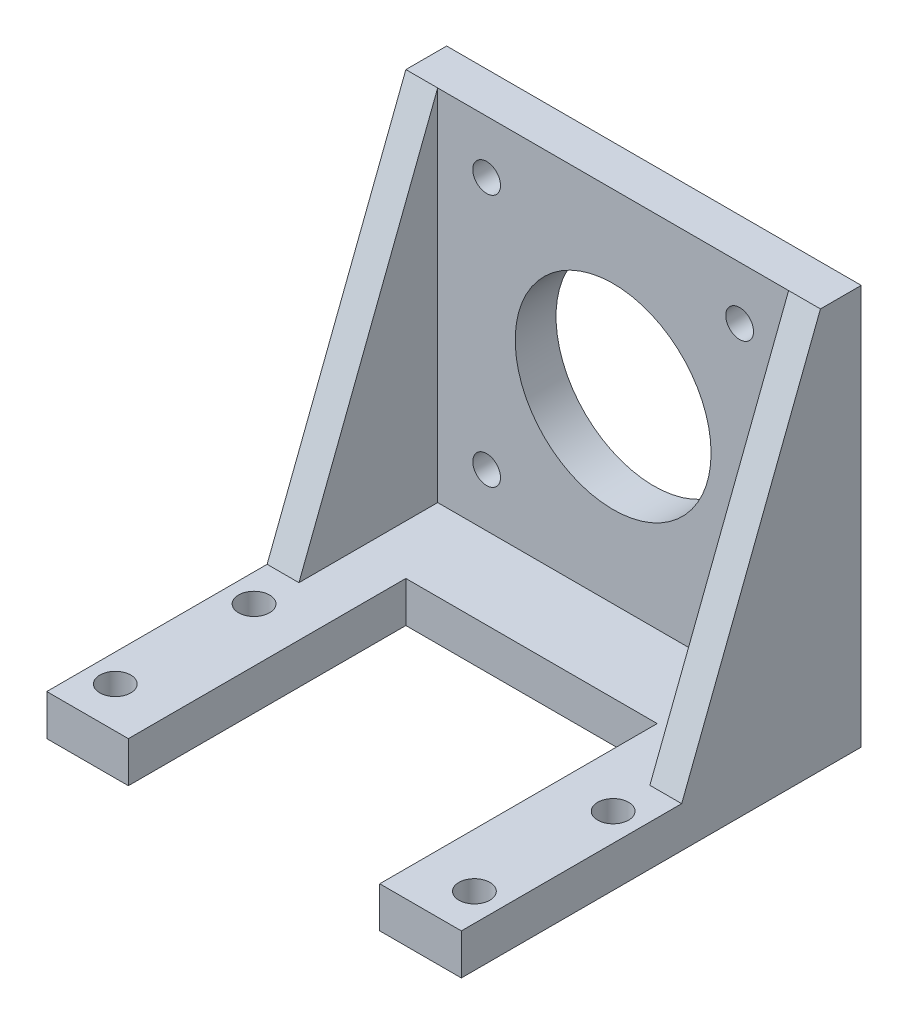
ISO-10303-21;
HEADER;
FILE_DESCRIPTION(('STEP AP214'),'2;1');
FILE_NAME('part.step','',(''),(''),'','','');
FILE_SCHEMA(('AUTOMOTIVE_DESIGN { 1 0 10303 214 1 1 1 1 }'));
ENDSEC;
DATA;
#1=APPLICATION_CONTEXT('core data for automotive mechanical design processes');
#2=APPLICATION_PROTOCOL_DEFINITION('international standard','automotive_design',2000,#1);
#3=PRODUCT_CONTEXT('',#1,'mechanical');
#4=PRODUCT('Part','Part','',(#3));
#5=PRODUCT_RELATED_PRODUCT_CATEGORY('part','',(#4));
#6=PRODUCT_DEFINITION_FORMATION('','',#4);
#7=PRODUCT_DEFINITION_CONTEXT('part definition',#1,'design');
#8=PRODUCT_DEFINITION('design','',#6,#7);
#9=PRODUCT_DEFINITION_SHAPE('','',#8);
#10=(LENGTH_UNIT() NAMED_UNIT(*) SI_UNIT(.MILLI.,.METRE.));
#11=(NAMED_UNIT(*) PLANE_ANGLE_UNIT() SI_UNIT($,.RADIAN.));
#12=(NAMED_UNIT(*) SI_UNIT($,.STERADIAN.) SOLID_ANGLE_UNIT());
#13=UNCERTAINTY_MEASURE_WITH_UNIT(LENGTH_MEASURE(1.E-05),#10,'distance_accuracy_value','');
#14=(GEOMETRIC_REPRESENTATION_CONTEXT(3) GLOBAL_UNCERTAINTY_ASSIGNED_CONTEXT((#13)) GLOBAL_UNIT_ASSIGNED_CONTEXT((#10,
#11,#12)) REPRESENTATION_CONTEXT('',''));
#15=CARTESIAN_POINT('',(0.,0.,0.));
#16=DIRECTION('',(0.,0.,1.));
#17=DIRECTION('',(1.,0.,0.));
#18=AXIS2_PLACEMENT_3D('',#15,#16,#17);
#19=CARTESIAN_POINT('',(25.4,22.,-22.));
#20=DIRECTION('',(0.,0.,-1.));
#21=DIRECTION('',(0.,1.,0.));
#22=AXIS2_PLACEMENT_3D('',#19,#20,#21);
#23=PLANE('',#22);
#24=CARTESIAN_POINT('',(-15.5,15.5,-22.));
#25=DIRECTION('',(0.,0.,1.));
#26=DIRECTION('',(1.,0.,0.));
#27=AXIS2_PLACEMENT_3D('',#24,#25,#26);
#28=CIRCLE('',#27,1.7);
#29=CARTESIAN_POINT('',(-13.8,15.5,-22.));
#30=VERTEX_POINT('',#29);
#31=EDGE_CURVE('E232',#30,#30,#28,.T.);
#32=ORIENTED_EDGE('',*,*,#31,.F.);
#33=EDGE_LOOP('',(#32));
#34=FACE_BOUND('',#33,.T.);
#35=CARTESIAN_POINT('',(15.5,15.5,-22.));
#36=DIRECTION('',(0.,0.,1.));
#37=DIRECTION('',(1.,0.,0.));
#38=AXIS2_PLACEMENT_3D('',#35,#36,#37);
#39=CIRCLE('',#38,1.7);
#40=CARTESIAN_POINT('',(17.2,15.5,-22.));
#41=VERTEX_POINT('',#40);
#42=EDGE_CURVE('E233',#41,#41,#39,.T.);
#43=ORIENTED_EDGE('',*,*,#42,.F.);
#44=EDGE_LOOP('',(#43));
#45=FACE_BOUND('',#44,.T.);
#46=CARTESIAN_POINT('',(15.5,-15.5,-22.));
#47=DIRECTION('',(0.,0.,1.));
#48=DIRECTION('',(1.,0.,0.));
#49=AXIS2_PLACEMENT_3D('',#46,#47,#48);
#50=CIRCLE('',#49,1.7);
#51=CARTESIAN_POINT('',(17.2,-15.5,-22.));
#52=VERTEX_POINT('',#51);
#53=EDGE_CURVE('E239',#52,#52,#50,.T.);
#54=ORIENTED_EDGE('',*,*,#53,.F.);
#55=EDGE_LOOP('',(#54));
#56=FACE_BOUND('',#55,.T.);
#57=CARTESIAN_POINT('',(-15.5,-15.5,-22.));
#58=DIRECTION('',(0.,0.,1.));
#59=DIRECTION('',(1.,0.,0.));
#60=AXIS2_PLACEMENT_3D('',#57,#58,#59);
#61=CIRCLE('',#60,1.7);
#62=CARTESIAN_POINT('',(-13.8,-15.5,-22.));
#63=VERTEX_POINT('',#62);
#64=EDGE_CURVE('E245',#63,#63,#61,.T.);
#65=ORIENTED_EDGE('',*,*,#64,.F.);
#66=EDGE_LOOP('',(#65));
#67=FACE_BOUND('',#66,.T.);
#68=CARTESIAN_POINT('',(0.,0.,-22.));
#69=DIRECTION('',(0.,0.,1.));
#70=DIRECTION('',(1.,0.,0.));
#71=AXIS2_PLACEMENT_3D('',#68,#69,#70);
#72=CIRCLE('',#71,12.);
#73=CARTESIAN_POINT('',(12.,0.,-22.));
#74=VERTEX_POINT('',#73);
#75=EDGE_CURVE('E222',#74,#74,#72,.T.);
#76=ORIENTED_EDGE('',*,*,#75,.F.);
#77=EDGE_LOOP('',(#76));
#78=FACE_BOUND('',#77,.T.);
#79=DIRECTION('',(-1.,0.,0.));
#80=VECTOR('',#79,1.);
#81=CARTESIAN_POINT('',(25.4,22.,-22.));
#82=LINE('',#81,#80);
#83=CARTESIAN_POINT('',(21.5,22.,-22.));
#84=VERTEX_POINT('',#83);
#85=CARTESIAN_POINT('',(-21.5,22.,-22.));
#86=VERTEX_POINT('',#85);
#87=EDGE_CURVE('E289',#84,#86,#82,.T.);
#88=ORIENTED_EDGE('',*,*,#87,.T.);
#89=DIRECTION('',(0.,-1.,0.));
#90=VECTOR('',#89,1.);
#91=CARTESIAN_POINT('',(-21.5,0.,-22.));
#92=LINE('',#91,#90);
#93=CARTESIAN_POINT('',(-21.5,-22.,-22.));
#94=VERTEX_POINT('',#93);
#95=EDGE_CURVE('E62',#86,#94,#92,.T.);
#96=ORIENTED_EDGE('',*,*,#95,.T.);
#97=DIRECTION('',(-1.,0.,0.));
#98=VECTOR('',#97,1.);
#99=CARTESIAN_POINT('',(25.4,-22.,-22.));
#100=LINE('',#99,#98);
#101=CARTESIAN_POINT('',(21.5,-22.,-22.));
#102=VERTEX_POINT('',#101);
#103=EDGE_CURVE('E288',#102,#94,#100,.T.);
#104=ORIENTED_EDGE('',*,*,#103,.F.);
#105=DIRECTION('',(0.,1.,0.));
#106=VECTOR('',#105,1.);
#107=CARTESIAN_POINT('',(21.5,0.,-22.));
#108=LINE('',#107,#106);
#109=EDGE_CURVE('E166',#102,#84,#108,.T.);
#110=ORIENTED_EDGE('',*,*,#109,.T.);
#111=EDGE_LOOP('',(#88,#96,#104,#110));
#112=FACE_BOUND('',#111,.T.);
#113=ADVANCED_FACE('F39',(#34,#45,#56,#67,#78,#112),#23,.F.);
#114=CARTESIAN_POINT('',(25.4,-22.,22.));
#115=DIRECTION('',(0.,-1.,0.));
#116=DIRECTION('',(0.,0.,-1.));
#117=AXIS2_PLACEMENT_3D('',#114,#115,#116);
#118=PLANE('',#117);
#119=CARTESIAN_POINT('',(22.,-22.,0.));
#120=DIRECTION('',(0.,1.,0.));
#121=DIRECTION('',(0.,0.,1.));
#122=AXIS2_PLACEMENT_3D('',#119,#120,#121);
#123=CIRCLE('',#122,1.89865);
#124=CARTESIAN_POINT('',(22.,-22.,1.89865));
#125=VERTEX_POINT('',#124);
#126=EDGE_CURVE('E188',#125,#125,#123,.T.);
#127=ORIENTED_EDGE('',*,*,#126,.F.);
#128=EDGE_LOOP('',(#127));
#129=FACE_BOUND('',#128,.T.);
#130=CARTESIAN_POINT('',(-22.,-22.,17.));
#131=DIRECTION('',(0.,1.,0.));
#132=DIRECTION('',(0.,0.,1.));
#133=AXIS2_PLACEMENT_3D('',#130,#131,#132);
#134=CIRCLE('',#133,1.89865);
#135=CARTESIAN_POINT('',(-22.,-22.,18.89865));
#136=VERTEX_POINT('',#135);
#137=EDGE_CURVE('E173',#136,#136,#134,.T.);
#138=ORIENTED_EDGE('',*,*,#137,.F.);
#139=EDGE_LOOP('',(#138));
#140=FACE_BOUND('',#139,.T.);
#141=CARTESIAN_POINT('',(22.,-22.,17.));
#142=DIRECTION('',(0.,1.,0.));
#143=DIRECTION('',(0.,0.,1.));
#144=AXIS2_PLACEMENT_3D('',#141,#142,#143);
#145=CIRCLE('',#144,1.89865);
#146=CARTESIAN_POINT('',(22.,-22.,18.89865));
#147=VERTEX_POINT('',#146);
#148=EDGE_CURVE('E182',#147,#147,#145,.T.);
#149=ORIENTED_EDGE('',*,*,#148,.F.);
#150=EDGE_LOOP('',(#149));
#151=FACE_BOUND('',#150,.T.);
#152=CARTESIAN_POINT('',(-22.,-22.,0.));
#153=DIRECTION('',(0.,1.,0.));
#154=DIRECTION('',(0.,0.,1.));
#155=AXIS2_PLACEMENT_3D('',#152,#153,#154);
#156=CIRCLE('',#155,1.89865);
#157=CARTESIAN_POINT('',(-22.,-22.,1.89865000000001));
#158=VERTEX_POINT('',#157);
#159=EDGE_CURVE('E189',#158,#158,#156,.T.);
#160=ORIENTED_EDGE('',*,*,#159,.F.);
#161=EDGE_LOOP('',(#160));
#162=FACE_BOUND('',#161,.T.);
#163=ORIENTED_EDGE('',*,*,#103,.T.);
#164=DIRECTION('',(0.,0.,1.));
#165=VECTOR('',#164,1.);
#166=CARTESIAN_POINT('',(-21.5,-22.,0.));
#167=LINE('',#166,#165);
#168=CARTESIAN_POINT('',(-21.5,-22.,-4.99999999999999));
#169=VERTEX_POINT('',#168);
#170=EDGE_CURVE('E54',#94,#169,#167,.T.);
#171=ORIENTED_EDGE('',*,*,#170,.T.);
#172=DIRECTION('',(-1.,0.,0.));
#173=VECTOR('',#172,1.);
#174=CARTESIAN_POINT('',(47.169905660283,-22.,-5.));
#175=LINE('',#174,#173);
#176=CARTESIAN_POINT('',(-25.4,-22.,-5.));
#177=VERTEX_POINT('',#176);
#178=EDGE_CURVE('E150',#169,#177,#175,.T.);
#179=ORIENTED_EDGE('',*,*,#178,.T.);
#180=DIRECTION('',(0.,0.,1.));
#181=VECTOR('',#180,1.);
#182=CARTESIAN_POINT('',(-25.4,-22.,22.));
#183=LINE('',#182,#181);
#184=CARTESIAN_POINT('',(-25.4,-22.,22.));
#185=VERTEX_POINT('',#184);
#186=EDGE_CURVE('E137',#177,#185,#183,.T.);
#187=ORIENTED_EDGE('',*,*,#186,.T.);
#188=DIRECTION('',(-1.,0.,0.));
#189=VECTOR('',#188,1.);
#190=CARTESIAN_POINT('',(25.4,-22.,22.));
#191=LINE('',#190,#189);
#192=CARTESIAN_POINT('',(-15.4,-22.,22.));
#193=VERTEX_POINT('',#192);
#194=EDGE_CURVE('E284',#193,#185,#191,.T.);
#195=ORIENTED_EDGE('',*,*,#194,.F.);
#196=DIRECTION('',(0.,0.,1.));
#197=VECTOR('',#196,1.);
#198=CARTESIAN_POINT('',(-15.4,-22.,22.));
#199=LINE('',#198,#197);
#200=CARTESIAN_POINT('',(-15.4,-22.,-12.));
#201=VERTEX_POINT('',#200);
#202=EDGE_CURVE('E207',#201,#193,#199,.T.);
#203=ORIENTED_EDGE('',*,*,#202,.F.);
#204=DIRECTION('',(-1.,0.,0.));
#205=VECTOR('',#204,1.);
#206=CARTESIAN_POINT('',(-15.4,-22.,-12.));
#207=LINE('',#206,#205);
#208=CARTESIAN_POINT('',(15.4,-22.,-12.));
#209=VERTEX_POINT('',#208);
#210=EDGE_CURVE('E216',#209,#201,#207,.T.);
#211=ORIENTED_EDGE('',*,*,#210,.F.);
#212=DIRECTION('',(0.,0.,-1.));
#213=VECTOR('',#212,1.);
#214=CARTESIAN_POINT('',(15.4,-22.,22.));
#215=LINE('',#214,#213);
#216=CARTESIAN_POINT('',(15.4,-22.,22.));
#217=VERTEX_POINT('',#216);
#218=EDGE_CURVE('E200',#217,#209,#215,.T.);
#219=ORIENTED_EDGE('',*,*,#218,.F.);
#220=CARTESIAN_POINT('',(25.4,-22.,22.));
#221=VERTEX_POINT('',#220);
#222=EDGE_CURVE('E285',#221,#217,#191,.T.);
#223=ORIENTED_EDGE('',*,*,#222,.F.);
#224=DIRECTION('',(0.,0.,1.));
#225=VECTOR('',#224,1.);
#226=CARTESIAN_POINT('',(25.4,-22.,22.));
#227=LINE('',#226,#225);
#228=CARTESIAN_POINT('',(25.4,-22.,-5.));
#229=VERTEX_POINT('',#228);
#230=EDGE_CURVE('E266',#229,#221,#227,.T.);
#231=ORIENTED_EDGE('',*,*,#230,.F.);
#232=DIRECTION('',(1.,0.,0.));
#233=VECTOR('',#232,1.);
#234=CARTESIAN_POINT('',(-47.169905660283,-22.,-5.));
#235=LINE('',#234,#233);
#236=CARTESIAN_POINT('',(21.5,-22.,-5.));
#237=VERTEX_POINT('',#236);
#238=EDGE_CURVE('E175',#237,#229,#235,.T.);
#239=ORIENTED_EDGE('',*,*,#238,.F.);
#240=DIRECTION('',(0.,0.,-1.));
#241=VECTOR('',#240,1.);
#242=CARTESIAN_POINT('',(21.5,-22.,0.));
#243=LINE('',#242,#241);
#244=EDGE_CURVE('E170',#237,#102,#243,.T.);
#245=ORIENTED_EDGE('',*,*,#244,.T.);
#246=EDGE_LOOP('',(#163,#171,#179,#187,#195,#203,#211,#219,#223,#231,#239,#245));
#247=FACE_BOUND('',#246,.T.);
#248=ADVANCED_FACE('F151',(#129,#140,#151,#162,#247),#118,.F.);
#249=CARTESIAN_POINT('',(25.4,-22.,22.));
#250=DIRECTION('',(0.,0.,-1.));
#251=DIRECTION('',(-1.,0.,0.));
#252=AXIS2_PLACEMENT_3D('',#249,#250,#251);
#253=PLANE('',#252);
#254=ORIENTED_EDGE('',*,*,#222,.T.);
#255=DIRECTION('',(0.,1.,0.));
#256=VECTOR('',#255,1.);
#257=CARTESIAN_POINT('',(15.4,-27.,22.));
#258=LINE('',#257,#256);
#259=CARTESIAN_POINT('',(15.4,-27.,22.));
#260=VERTEX_POINT('',#259);
#261=EDGE_CURVE('E220',#260,#217,#258,.T.);
#262=ORIENTED_EDGE('',*,*,#261,.F.);
#263=DIRECTION('',(-1.,0.,0.));
#264=VECTOR('',#263,1.);
#265=CARTESIAN_POINT('',(25.4,-27.,22.));
#266=LINE('',#265,#264);
#267=CARTESIAN_POINT('',(25.4,-27.,22.));
#268=VERTEX_POINT('',#267);
#269=EDGE_CURVE('E281',#268,#260,#266,.T.);
#270=ORIENTED_EDGE('',*,*,#269,.F.);
#271=DIRECTION('',(0.,-1.,0.));
#272=VECTOR('',#271,1.);
#273=CARTESIAN_POINT('',(25.4,-22.,22.));
#274=LINE('',#273,#272);
#275=EDGE_CURVE('E268',#221,#268,#274,.T.);
#276=ORIENTED_EDGE('',*,*,#275,.F.);
#277=EDGE_LOOP('',(#254,#262,#270,#276));
#278=FACE_BOUND('',#277,.T.);
#279=ADVANCED_FACE('F315',(#278),#253,.F.);
#280=CARTESIAN_POINT('',(25.4,22.,-27.));
#281=DIRECTION('',(0.,0.,1.));
#282=DIRECTION('',(0.,-1.,0.));
#283=AXIS2_PLACEMENT_3D('',#280,#281,#282);
#284=PLANE('',#283);
#285=CARTESIAN_POINT('',(0.,0.,-27.));
#286=DIRECTION('',(0.,0.,1.));
#287=DIRECTION('',(1.,0.,0.));
#288=AXIS2_PLACEMENT_3D('',#285,#286,#287);
#289=CIRCLE('',#288,12.);
#290=CARTESIAN_POINT('',(12.,0.,-27.));
#291=VERTEX_POINT('',#290);
#292=EDGE_CURVE('E248',#291,#291,#289,.T.);
#293=ORIENTED_EDGE('',*,*,#292,.T.);
#294=EDGE_LOOP('',(#293));
#295=FACE_BOUND('',#294,.T.);
#296=CARTESIAN_POINT('',(-15.5,-15.5,-27.));
#297=DIRECTION('',(0.,0.,1.));
#298=DIRECTION('',(1.,0.,0.));
#299=AXIS2_PLACEMENT_3D('',#296,#297,#298);
#300=CIRCLE('',#299,1.7);
#301=CARTESIAN_POINT('',(-13.8,-15.5,-27.));
#302=VERTEX_POINT('',#301);
#303=EDGE_CURVE('E242',#302,#302,#300,.T.);
#304=ORIENTED_EDGE('',*,*,#303,.T.);
#305=EDGE_LOOP('',(#304));
#306=FACE_BOUND('',#305,.T.);
#307=CARTESIAN_POINT('',(15.5,-15.5,-27.));
#308=DIRECTION('',(0.,0.,1.));
#309=DIRECTION('',(1.,0.,0.));
#310=AXIS2_PLACEMENT_3D('',#307,#308,#309);
#311=CIRCLE('',#310,1.7);
#312=CARTESIAN_POINT('',(17.2,-15.5,-27.));
#313=VERTEX_POINT('',#312);
#314=EDGE_CURVE('E236',#313,#313,#311,.T.);
#315=ORIENTED_EDGE('',*,*,#314,.T.);
#316=EDGE_LOOP('',(#315));
#317=FACE_BOUND('',#316,.T.);
#318=CARTESIAN_POINT('',(15.5,15.5,-27.));
#319=DIRECTION('',(0.,0.,1.));
#320=DIRECTION('',(1.,0.,0.));
#321=AXIS2_PLACEMENT_3D('',#318,#319,#320);
#322=CIRCLE('',#321,1.7);
#323=CARTESIAN_POINT('',(17.2,15.5,-27.));
#324=VERTEX_POINT('',#323);
#325=EDGE_CURVE('E229',#324,#324,#322,.T.);
#326=ORIENTED_EDGE('',*,*,#325,.T.);
#327=EDGE_LOOP('',(#326));
#328=FACE_BOUND('',#327,.T.);
#329=CARTESIAN_POINT('',(-15.5,15.5,-27.));
#330=DIRECTION('',(0.,0.,1.));
#331=DIRECTION('',(1.,0.,0.));
#332=AXIS2_PLACEMENT_3D('',#329,#330,#331);
#333=CIRCLE('',#332,1.7);
#334=CARTESIAN_POINT('',(-13.8,15.5,-27.));
#335=VERTEX_POINT('',#334);
#336=EDGE_CURVE('E253',#335,#335,#333,.T.);
#337=ORIENTED_EDGE('',*,*,#336,.T.);
#338=EDGE_LOOP('',(#337));
#339=FACE_BOUND('',#338,.T.);
#340=DIRECTION('',(0.,1.,0.));
#341=VECTOR('',#340,1.);
#342=CARTESIAN_POINT('',(-25.4,22.,-27.));
#343=LINE('',#342,#341);
#344=CARTESIAN_POINT('',(-25.4,-27.,-27.));
#345=VERTEX_POINT('',#344);
#346=CARTESIAN_POINT('',(-25.4,22.,-27.));
#347=VERTEX_POINT('',#346);
#348=EDGE_CURVE('E256',#345,#347,#343,.T.);
#349=ORIENTED_EDGE('',*,*,#348,.T.);
#350=DIRECTION('',(-1.,0.,0.));
#351=VECTOR('',#350,1.);
#352=CARTESIAN_POINT('',(25.4,22.,-27.));
#353=LINE('',#352,#351);
#354=CARTESIAN_POINT('',(25.4,22.,-27.));
#355=VERTEX_POINT('',#354);
#356=EDGE_CURVE('E12',#355,#347,#353,.T.);
#357=ORIENTED_EDGE('',*,*,#356,.F.);
#358=DIRECTION('',(0.,1.,0.));
#359=VECTOR('',#358,1.);
#360=CARTESIAN_POINT('',(25.4,22.,-27.));
#361=LINE('',#360,#359);
#362=CARTESIAN_POINT('',(25.4,-27.,-27.));
#363=VERTEX_POINT('',#362);
#364=EDGE_CURVE('E259',#363,#355,#361,.T.);
#365=ORIENTED_EDGE('',*,*,#364,.F.);
#366=DIRECTION('',(-1.,0.,0.));
#367=VECTOR('',#366,1.);
#368=CARTESIAN_POINT('',(25.4,-27.,-27.));
#369=LINE('',#368,#367);
#370=EDGE_CURVE('E272',#363,#345,#369,.T.);
#371=ORIENTED_EDGE('',*,*,#370,.T.);
#372=EDGE_LOOP('',(#349,#357,#365,#371));
#373=FACE_BOUND('',#372,.T.);
#374=ADVANCED_FACE('F41',(#295,#306,#317,#328,#339,#373),#284,.F.);
#375=CARTESIAN_POINT('',(25.4,22.,-22.));
#376=DIRECTION('',(0.,-1.,0.));
#377=DIRECTION('',(0.,0.,-1.));
#378=AXIS2_PLACEMENT_3D('',#375,#376,#377);
#379=PLANE('',#378);
#380=DIRECTION('',(0.,0.,1.));
#381=VECTOR('',#380,1.);
#382=CARTESIAN_POINT('',(-25.4,22.,-22.));
#383=LINE('',#382,#381);
#384=CARTESIAN_POINT('',(-25.4,22.,-22.));
#385=VERTEX_POINT('',#384);
#386=EDGE_CURVE('E147',#347,#385,#383,.T.);
#387=ORIENTED_EDGE('',*,*,#386,.T.);
#388=DIRECTION('',(-1.,0.,0.));
#389=VECTOR('',#388,1.);
#390=CARTESIAN_POINT('',(47.169905660283,22.,-22.));
#391=LINE('',#390,#389);
#392=EDGE_CURVE('E158',#86,#385,#391,.T.);
#393=ORIENTED_EDGE('',*,*,#392,.F.);
#394=ORIENTED_EDGE('',*,*,#87,.F.);
#395=CARTESIAN_POINT('',(25.4,22.,-22.));
#396=VERTEX_POINT('',#395);
#397=EDGE_CURVE('E47',#396,#84,#82,.T.);
#398=ORIENTED_EDGE('',*,*,#397,.F.);
#399=DIRECTION('',(0.,0.,1.));
#400=VECTOR('',#399,1.);
#401=CARTESIAN_POINT('',(25.4,22.,-22.));
#402=LINE('',#401,#400);
#403=EDGE_CURVE('E262',#355,#396,#402,.T.);
#404=ORIENTED_EDGE('',*,*,#403,.F.);
#405=ORIENTED_EDGE('',*,*,#356,.T.);
#406=EDGE_LOOP('',(#387,#393,#394,#398,#404,#405));
#407=FACE_BOUND('',#406,.T.);
#408=ADVANCED_FACE('F321',(#407),#379,.F.);
#409=CARTESIAN_POINT('',(-15.4,-27.,22.));
#410=VERTEX_POINT('',#409);
#411=CARTESIAN_POINT('',(-25.4,-27.,22.));
#412=VERTEX_POINT('',#411);
#413=EDGE_CURVE('E280',#410,#412,#266,.T.);
#414=ORIENTED_EDGE('',*,*,#413,.F.);
#415=DIRECTION('',(0.,1.,0.));
#416=VECTOR('',#415,1.);
#417=CARTESIAN_POINT('',(-15.4,-27.,22.));
#418=LINE('',#417,#416);
#419=EDGE_CURVE('E223',#410,#193,#418,.T.);
#420=ORIENTED_EDGE('',*,*,#419,.T.);
#421=ORIENTED_EDGE('',*,*,#194,.T.);
#422=DIRECTION('',(0.,-1.,0.));
#423=VECTOR('',#422,1.);
#424=CARTESIAN_POINT('',(-25.4,-22.,22.));
#425=LINE('',#424,#423);
#426=EDGE_CURVE('E144',#185,#412,#425,.T.);
#427=ORIENTED_EDGE('',*,*,#426,.T.);
#428=EDGE_LOOP('',(#414,#420,#421,#427));
#429=FACE_BOUND('',#428,.T.);
#430=ADVANCED_FACE('F323',(#429),#253,.F.);
#431=CARTESIAN_POINT('',(25.4,-27.,22.));
#432=DIRECTION('',(0.,1.,0.));
#433=DIRECTION('',(0.,0.,1.));
#434=AXIS2_PLACEMENT_3D('',#431,#432,#433);
#435=PLANE('',#434);
#436=CARTESIAN_POINT('',(-22.,-27.,0.));
#437=DIRECTION('',(0.,1.,0.));
#438=DIRECTION('',(0.,0.,1.));
#439=AXIS2_PLACEMENT_3D('',#436,#437,#438);
#440=CIRCLE('',#439,1.89865);
#441=CARTESIAN_POINT('',(-22.,-27.,1.89865000000001));
#442=VERTEX_POINT('',#441);
#443=EDGE_CURVE('E185',#442,#442,#440,.T.);
#444=ORIENTED_EDGE('',*,*,#443,.T.);
#445=EDGE_LOOP('',(#444));
#446=FACE_BOUND('',#445,.T.);
#447=CARTESIAN_POINT('',(22.,-27.,17.));
#448=DIRECTION('',(0.,1.,0.));
#449=DIRECTION('',(0.,0.,1.));
#450=AXIS2_PLACEMENT_3D('',#447,#448,#449);
#451=CIRCLE('',#450,1.89865);
#452=CARTESIAN_POINT('',(22.,-27.,18.89865));
#453=VERTEX_POINT('',#452);
#454=EDGE_CURVE('E192',#453,#453,#451,.T.);
#455=ORIENTED_EDGE('',*,*,#454,.T.);
#456=EDGE_LOOP('',(#455));
#457=FACE_BOUND('',#456,.T.);
#458=CARTESIAN_POINT('',(-22.,-27.,17.));
#459=DIRECTION('',(0.,1.,0.));
#460=DIRECTION('',(0.,0.,1.));
#461=AXIS2_PLACEMENT_3D('',#458,#459,#460);
#462=CIRCLE('',#461,1.89865);
#463=CARTESIAN_POINT('',(-22.,-27.,18.89865));
#464=VERTEX_POINT('',#463);
#465=EDGE_CURVE('E179',#464,#464,#462,.T.);
#466=ORIENTED_EDGE('',*,*,#465,.T.);
#467=EDGE_LOOP('',(#466));
#468=FACE_BOUND('',#467,.T.);
#469=CARTESIAN_POINT('',(22.,-27.,0.));
#470=DIRECTION('',(0.,1.,0.));
#471=DIRECTION('',(0.,0.,1.));
#472=AXIS2_PLACEMENT_3D('',#469,#470,#471);
#473=CIRCLE('',#472,1.89865);
#474=CARTESIAN_POINT('',(22.,-27.,1.89865));
#475=VERTEX_POINT('',#474);
#476=EDGE_CURVE('E197',#475,#475,#473,.T.);
#477=ORIENTED_EDGE('',*,*,#476,.T.);
#478=EDGE_LOOP('',(#477));
#479=FACE_BOUND('',#478,.T.);
#480=ORIENTED_EDGE('',*,*,#269,.T.);
#481=DIRECTION('',(0.,0.,-1.));
#482=VECTOR('',#481,1.);
#483=CARTESIAN_POINT('',(15.4,-27.,22.));
#484=LINE('',#483,#482);
#485=CARTESIAN_POINT('',(15.4,-27.,-12.));
#486=VERTEX_POINT('',#485);
#487=EDGE_CURVE('E203',#260,#486,#484,.T.);
#488=ORIENTED_EDGE('',*,*,#487,.T.);
#489=DIRECTION('',(-1.,0.,0.));
#490=VECTOR('',#489,1.);
#491=CARTESIAN_POINT('',(-15.4,-27.,-12.));
#492=LINE('',#491,#490);
#493=CARTESIAN_POINT('',(-15.4,-27.,-12.));
#494=VERTEX_POINT('',#493);
#495=EDGE_CURVE('E206',#486,#494,#492,.T.);
#496=ORIENTED_EDGE('',*,*,#495,.T.);
#497=DIRECTION('',(0.,0.,1.));
#498=VECTOR('',#497,1.);
#499=CARTESIAN_POINT('',(-15.4,-27.,22.));
#500=LINE('',#499,#498);
#501=EDGE_CURVE('E210',#494,#410,#500,.T.);
#502=ORIENTED_EDGE('',*,*,#501,.T.);
#503=ORIENTED_EDGE('',*,*,#413,.T.);
#504=DIRECTION('',(0.,0.,-1.));
#505=VECTOR('',#504,1.);
#506=CARTESIAN_POINT('',(-25.4,-27.,22.));
#507=LINE('',#506,#505);
#508=EDGE_CURVE('E263',#412,#345,#507,.T.);
#509=ORIENTED_EDGE('',*,*,#508,.T.);
#510=ORIENTED_EDGE('',*,*,#370,.F.);
#511=DIRECTION('',(0.,0.,-1.));
#512=VECTOR('',#511,1.);
#513=CARTESIAN_POINT('',(25.4,-27.,22.));
#514=LINE('',#513,#512);
#515=EDGE_CURVE('E270',#268,#363,#514,.T.);
#516=ORIENTED_EDGE('',*,*,#515,.F.);
#517=EDGE_LOOP('',(#480,#488,#496,#502,#503,#509,#510,#516));
#518=FACE_BOUND('',#517,.T.);
#519=ADVANCED_FACE('F328',(#446,#457,#468,#479,#518),#435,.F.);
#520=CARTESIAN_POINT('',(25.4,0.,0.));
#521=DIRECTION('',(1.,0.,0.));
#522=DIRECTION('',(0.,0.,-1.));
#523=AXIS2_PLACEMENT_3D('',#520,#521,#522);
#524=PLANE('',#523);
#525=DIRECTION('',(0.,0.932798134405597,-0.360399279202162));
#526=VECTOR('',#525,1.);
#527=CARTESIAN_POINT('',(25.4,-4.53842696629213,-11.7465168539326));
#528=LINE('',#527,#526);
#529=EDGE_CURVE('E165',#229,#396,#528,.T.);
#530=ORIENTED_EDGE('',*,*,#529,.F.);
#531=ORIENTED_EDGE('',*,*,#230,.T.);
#532=ORIENTED_EDGE('',*,*,#275,.T.);
#533=ORIENTED_EDGE('',*,*,#515,.T.);
#534=ORIENTED_EDGE('',*,*,#364,.T.);
#535=ORIENTED_EDGE('',*,*,#403,.T.);
#536=EDGE_LOOP('',(#530,#531,#532,#533,#534,#535));
#537=FACE_BOUND('',#536,.T.);
#538=ADVANCED_FACE('F358',(#537),#524,.T.);
#539=CARTESIAN_POINT('',(-25.4,0.,0.));
#540=DIRECTION('',(1.,0.,0.));
#541=DIRECTION('',(0.,0.,-1.));
#542=AXIS2_PLACEMENT_3D('',#539,#540,#541);
#543=PLANE('',#542);
#544=ORIENTED_EDGE('',*,*,#348,.F.);
#545=ORIENTED_EDGE('',*,*,#508,.F.);
#546=ORIENTED_EDGE('',*,*,#426,.F.);
#547=ORIENTED_EDGE('',*,*,#186,.F.);
#548=DIRECTION('',(0.,0.932798134405597,-0.360399279202162));
#549=VECTOR('',#548,1.);
#550=CARTESIAN_POINT('',(-25.4,-4.53842696629213,-11.7465168539326));
#551=LINE('',#550,#549);
#552=EDGE_CURVE('E141',#177,#385,#551,.T.);
#553=ORIENTED_EDGE('',*,*,#552,.T.);
#554=ORIENTED_EDGE('',*,*,#386,.F.);
#555=EDGE_LOOP('',(#544,#545,#546,#547,#553,#554));
#556=FACE_BOUND('',#555,.T.);
#557=ADVANCED_FACE('F139',(#556),#543,.F.);
#558=CARTESIAN_POINT('',(-15.5,15.5,-27.));
#559=DIRECTION('',(0.,0.,1.));
#560=DIRECTION('',(1.,0.,0.));
#561=AXIS2_PLACEMENT_3D('',#558,#559,#560);
#562=CYLINDRICAL_SURFACE('',#561,1.7);
#563=ORIENTED_EDGE('',*,*,#336,.F.);
#564=EDGE_LOOP('',(#563));
#565=FACE_BOUND('',#564,.T.);
#566=ORIENTED_EDGE('',*,*,#31,.T.);
#567=EDGE_LOOP('',(#566));
#568=FACE_BOUND('',#567,.T.);
#569=ADVANCED_FACE('F393',(#565,#568),#562,.F.);
#570=CARTESIAN_POINT('',(15.5,15.5,-27.));
#571=DIRECTION('',(0.,0.,1.));
#572=DIRECTION('',(1.,0.,0.));
#573=AXIS2_PLACEMENT_3D('',#570,#571,#572);
#574=CYLINDRICAL_SURFACE('',#573,1.7);
#575=ORIENTED_EDGE('',*,*,#325,.F.);
#576=EDGE_LOOP('',(#575));
#577=FACE_BOUND('',#576,.T.);
#578=ORIENTED_EDGE('',*,*,#42,.T.);
#579=EDGE_LOOP('',(#578));
#580=FACE_BOUND('',#579,.T.);
#581=ADVANCED_FACE('F389',(#577,#580),#574,.F.);
#582=CARTESIAN_POINT('',(15.5,-15.5,-27.));
#583=DIRECTION('',(0.,0.,1.));
#584=DIRECTION('',(1.,0.,0.));
#585=AXIS2_PLACEMENT_3D('',#582,#583,#584);
#586=CYLINDRICAL_SURFACE('',#585,1.7);
#587=ORIENTED_EDGE('',*,*,#314,.F.);
#588=EDGE_LOOP('',(#587));
#589=FACE_BOUND('',#588,.T.);
#590=ORIENTED_EDGE('',*,*,#53,.T.);
#591=EDGE_LOOP('',(#590));
#592=FACE_BOUND('',#591,.T.);
#593=ADVANCED_FACE('F392',(#589,#592),#586,.F.);
#594=CARTESIAN_POINT('',(-15.5,-15.5,-27.));
#595=DIRECTION('',(0.,0.,1.));
#596=DIRECTION('',(1.,0.,0.));
#597=AXIS2_PLACEMENT_3D('',#594,#595,#596);
#598=CYLINDRICAL_SURFACE('',#597,1.7);
#599=ORIENTED_EDGE('',*,*,#303,.F.);
#600=EDGE_LOOP('',(#599));
#601=FACE_BOUND('',#600,.T.);
#602=ORIENTED_EDGE('',*,*,#64,.T.);
#603=EDGE_LOOP('',(#602));
#604=FACE_BOUND('',#603,.T.);
#605=ADVANCED_FACE('F397',(#601,#604),#598,.F.);
#606=CARTESIAN_POINT('',(0.,0.,-27.));
#607=DIRECTION('',(0.,0.,1.));
#608=DIRECTION('',(1.,0.,0.));
#609=AXIS2_PLACEMENT_3D('',#606,#607,#608);
#610=CYLINDRICAL_SURFACE('',#609,12.);
#611=ORIENTED_EDGE('',*,*,#292,.F.);
#612=EDGE_LOOP('',(#611));
#613=FACE_BOUND('',#612,.T.);
#614=ORIENTED_EDGE('',*,*,#75,.T.);
#615=EDGE_LOOP('',(#614));
#616=FACE_BOUND('',#615,.T.);
#617=ADVANCED_FACE('F388',(#613,#616),#610,.F.);
#618=CARTESIAN_POINT('',(15.4,-27.,22.));
#619=DIRECTION('',(1.,0.,0.));
#620=DIRECTION('',(0.,0.,-1.));
#621=AXIS2_PLACEMENT_3D('',#618,#619,#620);
#622=PLANE('',#621);
#623=ORIENTED_EDGE('',*,*,#218,.T.);
#624=DIRECTION('',(0.,1.,0.));
#625=VECTOR('',#624,1.);
#626=CARTESIAN_POINT('',(15.4,-27.,-12.));
#627=LINE('',#626,#625);
#628=EDGE_CURVE('E213',#486,#209,#627,.T.);
#629=ORIENTED_EDGE('',*,*,#628,.F.);
#630=ORIENTED_EDGE('',*,*,#487,.F.);
#631=ORIENTED_EDGE('',*,*,#261,.T.);
#632=EDGE_LOOP('',(#623,#629,#630,#631));
#633=FACE_BOUND('',#632,.T.);
#634=ADVANCED_FACE('F349',(#633),#622,.F.);
#635=CARTESIAN_POINT('',(-15.4,-27.,22.));
#636=DIRECTION('',(-1.,0.,0.));
#637=DIRECTION('',(0.,0.,1.));
#638=AXIS2_PLACEMENT_3D('',#635,#636,#637);
#639=PLANE('',#638);
#640=ORIENTED_EDGE('',*,*,#202,.T.);
#641=ORIENTED_EDGE('',*,*,#419,.F.);
#642=ORIENTED_EDGE('',*,*,#501,.F.);
#643=DIRECTION('',(0.,1.,0.));
#644=VECTOR('',#643,1.);
#645=CARTESIAN_POINT('',(-15.4,-27.,-12.));
#646=LINE('',#645,#644);
#647=EDGE_CURVE('E226',#494,#201,#646,.T.);
#648=ORIENTED_EDGE('',*,*,#647,.T.);
#649=EDGE_LOOP('',(#640,#641,#642,#648));
#650=FACE_BOUND('',#649,.T.);
#651=ADVANCED_FACE('F343',(#650),#639,.F.);
#652=CARTESIAN_POINT('',(-15.4,-27.,-12.));
#653=DIRECTION('',(0.,0.,-1.));
#654=DIRECTION('',(-1.,0.,0.));
#655=AXIS2_PLACEMENT_3D('',#652,#653,#654);
#656=PLANE('',#655);
#657=ORIENTED_EDGE('',*,*,#210,.T.);
#658=ORIENTED_EDGE('',*,*,#647,.F.);
#659=ORIENTED_EDGE('',*,*,#495,.F.);
#660=ORIENTED_EDGE('',*,*,#628,.T.);
#661=EDGE_LOOP('',(#657,#658,#659,#660));
#662=FACE_BOUND('',#661,.T.);
#663=ADVANCED_FACE('F347',(#662),#656,.F.);
#664=CARTESIAN_POINT('',(22.,-27.,0.));
#665=DIRECTION('',(0.,1.,0.));
#666=DIRECTION('',(0.,0.,1.));
#667=AXIS2_PLACEMENT_3D('',#664,#665,#666);
#668=CYLINDRICAL_SURFACE('',#667,1.89865);
#669=ORIENTED_EDGE('',*,*,#476,.F.);
#670=EDGE_LOOP('',(#669));
#671=FACE_BOUND('',#670,.T.);
#672=ORIENTED_EDGE('',*,*,#126,.T.);
#673=EDGE_LOOP('',(#672));
#674=FACE_BOUND('',#673,.T.);
#675=ADVANCED_FACE('F373',(#671,#674),#668,.F.);
#676=CARTESIAN_POINT('',(-22.,-27.,17.));
#677=DIRECTION('',(0.,1.,0.));
#678=DIRECTION('',(0.,0.,1.));
#679=AXIS2_PLACEMENT_3D('',#676,#677,#678);
#680=CYLINDRICAL_SURFACE('',#679,1.89865);
#681=ORIENTED_EDGE('',*,*,#465,.F.);
#682=EDGE_LOOP('',(#681));
#683=FACE_BOUND('',#682,.T.);
#684=ORIENTED_EDGE('',*,*,#137,.T.);
#685=EDGE_LOOP('',(#684));
#686=FACE_BOUND('',#685,.T.);
#687=ADVANCED_FACE('F371',(#683,#686),#680,.F.);
#688=CARTESIAN_POINT('',(22.,-27.,17.));
#689=DIRECTION('',(0.,1.,0.));
#690=DIRECTION('',(0.,0.,1.));
#691=AXIS2_PLACEMENT_3D('',#688,#689,#690);
#692=CYLINDRICAL_SURFACE('',#691,1.89865);
#693=ORIENTED_EDGE('',*,*,#454,.F.);
#694=EDGE_LOOP('',(#693));
#695=FACE_BOUND('',#694,.T.);
#696=ORIENTED_EDGE('',*,*,#148,.T.);
#697=EDGE_LOOP('',(#696));
#698=FACE_BOUND('',#697,.T.);
#699=ADVANCED_FACE('F367',(#695,#698),#692,.F.);
#700=CARTESIAN_POINT('',(-22.,-27.,0.));
#701=DIRECTION('',(0.,1.,0.));
#702=DIRECTION('',(0.,0.,1.));
#703=AXIS2_PLACEMENT_3D('',#700,#701,#702);
#704=CYLINDRICAL_SURFACE('',#703,1.89865);
#705=ORIENTED_EDGE('',*,*,#443,.F.);
#706=EDGE_LOOP('',(#705));
#707=FACE_BOUND('',#706,.T.);
#708=ORIENTED_EDGE('',*,*,#159,.T.);
#709=EDGE_LOOP('',(#708));
#710=FACE_BOUND('',#709,.T.);
#711=ADVANCED_FACE('F361',(#707,#710),#704,.F.);
#712=CARTESIAN_POINT('',(-47.169905660283,-4.53842696629213,-11.7465168539326));
#713=DIRECTION('',(0.,-0.360399279202162,-0.932798134405597));
#714=DIRECTION('',(0.,0.932798134405597,-0.360399279202162));
#715=AXIS2_PLACEMENT_3D('',#712,#713,#714);
#716=PLANE('',#715);
#717=ORIENTED_EDGE('',*,*,#397,.T.);
#718=DIRECTION('',(0.,-0.932798134405597,0.360399279202162));
#719=VECTOR('',#718,1.);
#720=CARTESIAN_POINT('',(21.5,-4.53842696629213,-11.7465168539326));
#721=LINE('',#720,#719);
#722=EDGE_CURVE('E169',#84,#237,#721,.T.);
#723=ORIENTED_EDGE('',*,*,#722,.T.);
#724=ORIENTED_EDGE('',*,*,#238,.T.);
#725=ORIENTED_EDGE('',*,*,#529,.T.);
#726=EDGE_LOOP('',(#717,#723,#724,#725));
#727=FACE_BOUND('',#726,.T.);
#728=ADVANCED_FACE('F305',(#727),#716,.F.);
#729=CARTESIAN_POINT('',(21.5,0.,0.));
#730=DIRECTION('',(1.,0.,0.));
#731=DIRECTION('',(0.,0.,-1.));
#732=AXIS2_PLACEMENT_3D('',#729,#730,#731);
#733=PLANE('',#732);
#734=ORIENTED_EDGE('',*,*,#109,.F.);
#735=ORIENTED_EDGE('',*,*,#244,.F.);
#736=ORIENTED_EDGE('',*,*,#722,.F.);
#737=EDGE_LOOP('',(#734,#735,#736));
#738=FACE_BOUND('',#737,.T.);
#739=ADVANCED_FACE('F298',(#738),#733,.F.);
#740=CARTESIAN_POINT('',(-21.5,0.,0.));
#741=DIRECTION('',(1.,0.,0.));
#742=DIRECTION('',(0.,0.,-1.));
#743=AXIS2_PLACEMENT_3D('',#740,#741,#742);
#744=PLANE('',#743);
#745=DIRECTION('',(0.,0.932798134405597,-0.360399279202162));
#746=VECTOR('',#745,1.);
#747=CARTESIAN_POINT('',(-21.5,-4.53842696629213,-11.7465168539326));
#748=LINE('',#747,#746);
#749=EDGE_CURVE('E154',#169,#86,#748,.T.);
#750=ORIENTED_EDGE('',*,*,#749,.F.);
#751=ORIENTED_EDGE('',*,*,#170,.F.);
#752=ORIENTED_EDGE('',*,*,#95,.F.);
#753=EDGE_LOOP('',(#750,#751,#752));
#754=FACE_BOUND('',#753,.T.);
#755=ADVANCED_FACE('F296',(#754),#744,.T.);
#756=CARTESIAN_POINT('',(47.169905660283,-4.53842696629213,-11.7465168539326));
#757=DIRECTION('',(0.,0.360399279202162,0.932798134405597));
#758=DIRECTION('',(0.,-0.932798134405597,0.360399279202162));
#759=AXIS2_PLACEMENT_3D('',#756,#757,#758);
#760=PLANE('',#759);
#761=ORIENTED_EDGE('',*,*,#178,.F.);
#762=ORIENTED_EDGE('',*,*,#749,.T.);
#763=ORIENTED_EDGE('',*,*,#392,.T.);
#764=ORIENTED_EDGE('',*,*,#552,.F.);
#765=EDGE_LOOP('',(#761,#762,#763,#764));
#766=FACE_BOUND('',#765,.T.);
#767=ADVANCED_FACE('F157',(#766),#760,.T.);
#768=CLOSED_SHELL('',(#113,#248,#279,#374,#408,#430,#519,#538,#557,#569,#581,#593,#605,#617,
#634,#651,#663,#675,#687,#699,#711,#728,#739,#755,#767));
#769=MANIFOLD_SOLID_BREP('B2',#768);
#770=ADVANCED_BREP_SHAPE_REPRESENTATION('',(#18,#769),#14);
#771=SHAPE_DEFINITION_REPRESENTATION(#9,#770);
ENDSEC;
END-ISO-10303-21;
